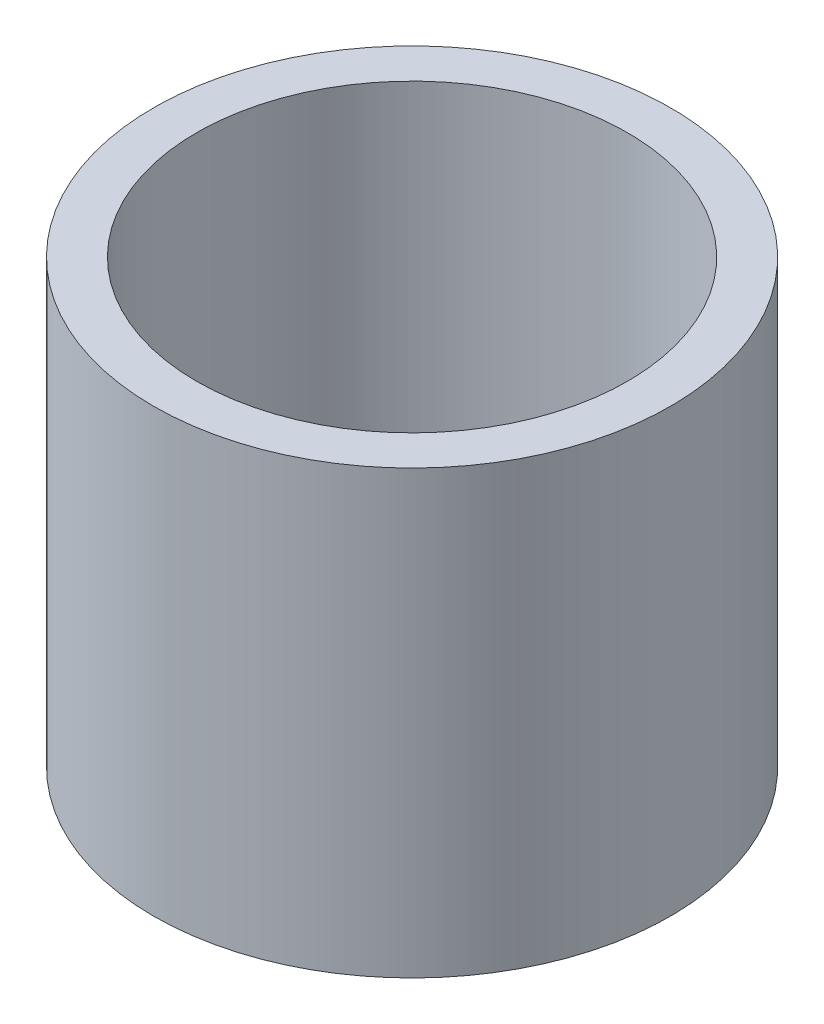
ISO-10303-21;
HEADER;
FILE_DESCRIPTION(('STEP AP214'),'2;1');
FILE_NAME('part.step','',(''),(''),'','','');
FILE_SCHEMA(('AUTOMOTIVE_DESIGN { 1 0 10303 214 1 1 1 1 }'));
ENDSEC;
DATA;
#1=APPLICATION_CONTEXT('core data for automotive mechanical design processes');
#2=APPLICATION_PROTOCOL_DEFINITION('international standard','automotive_design',2000,#1);
#3=PRODUCT_CONTEXT('',#1,'mechanical');
#4=PRODUCT('Part','Part','',(#3));
#5=PRODUCT_RELATED_PRODUCT_CATEGORY('part','',(#4));
#6=PRODUCT_DEFINITION_FORMATION('','',#4);
#7=PRODUCT_DEFINITION_CONTEXT('part definition',#1,'design');
#8=PRODUCT_DEFINITION('design','',#6,#7);
#9=PRODUCT_DEFINITION_SHAPE('','',#8);
#10=(LENGTH_UNIT() NAMED_UNIT(*) SI_UNIT(.MILLI.,.METRE.));
#11=(NAMED_UNIT(*) PLANE_ANGLE_UNIT() SI_UNIT($,.RADIAN.));
#12=(NAMED_UNIT(*) SI_UNIT($,.STERADIAN.) SOLID_ANGLE_UNIT());
#13=UNCERTAINTY_MEASURE_WITH_UNIT(LENGTH_MEASURE(1.E-05),#10,'distance_accuracy_value','');
#14=(GEOMETRIC_REPRESENTATION_CONTEXT(3) GLOBAL_UNCERTAINTY_ASSIGNED_CONTEXT((#13)) GLOBAL_UNIT_ASSIGNED_CONTEXT((#10,
#11,#12)) REPRESENTATION_CONTEXT('',''));
#15=CARTESIAN_POINT('',(0.,0.,0.));
#16=DIRECTION('',(0.,0.,1.));
#17=DIRECTION('',(1.,0.,0.));
#18=AXIS2_PLACEMENT_3D('',#15,#16,#17);
#19=CARTESIAN_POINT('',(0.,10.25,0.));
#20=DIRECTION('',(0.,1.,0.));
#21=DIRECTION('',(0.,0.,1.));
#22=AXIS2_PLACEMENT_3D('',#19,#20,#21);
#23=PLANE('',#22);
#24=CARTESIAN_POINT('',(0.,10.25,0.));
#25=DIRECTION('',(0.,1.,0.));
#26=DIRECTION('',(0.,0.,1.));
#27=AXIS2_PLACEMENT_3D('',#24,#25,#26);
#28=CIRCLE('',#27,12.);
#29=CARTESIAN_POINT('',(0.,10.25,12.));
#30=VERTEX_POINT('',#29);
#31=EDGE_CURVE('E10',#30,#30,#28,.T.);
#32=ORIENTED_EDGE('',*,*,#31,.T.);
#33=EDGE_LOOP('',(#32));
#34=FACE_BOUND('',#33,.T.);
#35=CARTESIAN_POINT('',(0.,10.25,0.));
#36=DIRECTION('',(0.,1.,0.));
#37=DIRECTION('',(0.,0.,1.));
#38=AXIS2_PLACEMENT_3D('',#35,#36,#37);
#39=CIRCLE('',#38,10.);
#40=CARTESIAN_POINT('',(0.,10.25,10.));
#41=VERTEX_POINT('',#40);
#42=EDGE_CURVE('E42',#41,#41,#39,.T.);
#43=ORIENTED_EDGE('',*,*,#42,.F.);
#44=EDGE_LOOP('',(#43));
#45=FACE_BOUND('',#44,.T.);
#46=ADVANCED_FACE('F31',(#34,#45),#23,.T.);
#47=CARTESIAN_POINT('',(0.,-10.25,0.));
#48=DIRECTION('',(0.,1.,0.));
#49=DIRECTION('',(0.,0.,1.));
#50=AXIS2_PLACEMENT_3D('',#47,#48,#49);
#51=PLANE('',#50);
#52=CARTESIAN_POINT('',(0.,-10.25,0.));
#53=DIRECTION('',(0.,1.,0.));
#54=DIRECTION('',(0.,0.,1.));
#55=AXIS2_PLACEMENT_3D('',#52,#53,#54);
#56=CIRCLE('',#55,12.);
#57=CARTESIAN_POINT('',(0.,-10.25,12.));
#58=VERTEX_POINT('',#57);
#59=EDGE_CURVE('E35',#58,#58,#56,.T.);
#60=ORIENTED_EDGE('',*,*,#59,.F.);
#61=EDGE_LOOP('',(#60));
#62=FACE_BOUND('',#61,.T.);
#63=CARTESIAN_POINT('',(0.,-10.25,0.));
#64=DIRECTION('',(0.,1.,0.));
#65=DIRECTION('',(0.,0.,1.));
#66=AXIS2_PLACEMENT_3D('',#63,#64,#65);
#67=CIRCLE('',#66,10.);
#68=CARTESIAN_POINT('',(0.,-10.25,10.));
#69=VERTEX_POINT('',#68);
#70=EDGE_CURVE('E44',#69,#69,#67,.T.);
#71=ORIENTED_EDGE('',*,*,#70,.T.);
#72=EDGE_LOOP('',(#71));
#73=FACE_BOUND('',#72,.T.);
#74=ADVANCED_FACE('F54',(#62,#73),#51,.F.);
#75=CARTESIAN_POINT('',(0.,10.25,0.));
#76=DIRECTION('',(0.,-1.,0.));
#77=DIRECTION('',(0.,0.,-1.));
#78=AXIS2_PLACEMENT_3D('',#75,#76,#77);
#79=CYLINDRICAL_SURFACE('',#78,12.);
#80=ORIENTED_EDGE('',*,*,#31,.F.);
#81=EDGE_LOOP('',(#80));
#82=FACE_BOUND('',#81,.T.);
#83=ORIENTED_EDGE('',*,*,#59,.T.);
#84=EDGE_LOOP('',(#83));
#85=FACE_BOUND('',#84,.T.);
#86=ADVANCED_FACE('F33',(#82,#85),#79,.T.);
#87=CARTESIAN_POINT('',(0.,10.25,0.));
#88=DIRECTION('',(0.,-1.,0.));
#89=DIRECTION('',(0.,0.,-1.));
#90=AXIS2_PLACEMENT_3D('',#87,#88,#89);
#91=CYLINDRICAL_SURFACE('',#90,10.);
#92=ORIENTED_EDGE('',*,*,#42,.T.);
#93=EDGE_LOOP('',(#92));
#94=FACE_BOUND('',#93,.T.);
#95=ORIENTED_EDGE('',*,*,#70,.F.);
#96=EDGE_LOOP('',(#95));
#97=FACE_BOUND('',#96,.T.);
#98=ADVANCED_FACE('F50',(#94,#97),#91,.F.);
#99=CLOSED_SHELL('',(#46,#74,#86,#98));
#100=MANIFOLD_SOLID_BREP('B2',#99);
#101=ADVANCED_BREP_SHAPE_REPRESENTATION('',(#18,#100),#14);
#102=SHAPE_DEFINITION_REPRESENTATION(#9,#101);
ENDSEC;
END-ISO-10303-21;
